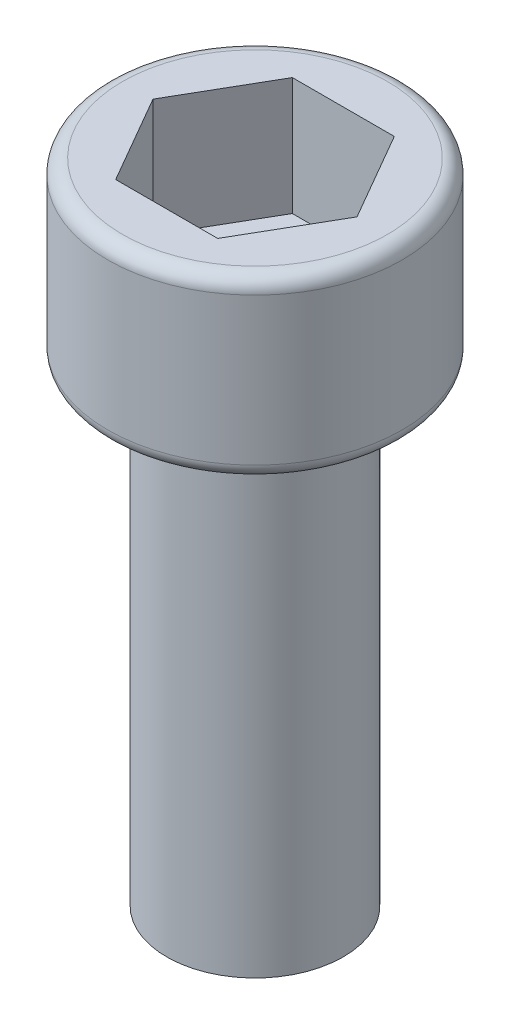
ISO-10303-21;
HEADER;
FILE_DESCRIPTION(('STEP AP214'),'2;1');
FILE_NAME('part.step','',(''),(''),'','','');
FILE_SCHEMA(('AUTOMOTIVE_DESIGN { 1 0 10303 214 1 1 1 1 }'));
ENDSEC;
DATA;
#1=APPLICATION_CONTEXT('core data for automotive mechanical design processes');
#2=APPLICATION_PROTOCOL_DEFINITION('international standard','automotive_design',2000,#1);
#3=PRODUCT_CONTEXT('',#1,'mechanical');
#4=PRODUCT('Part','Part','',(#3));
#5=PRODUCT_RELATED_PRODUCT_CATEGORY('part','',(#4));
#6=PRODUCT_DEFINITION_FORMATION('','',#4);
#7=PRODUCT_DEFINITION_CONTEXT('part definition',#1,'design');
#8=PRODUCT_DEFINITION('design','',#6,#7);
#9=PRODUCT_DEFINITION_SHAPE('','',#8);
#10=(LENGTH_UNIT() NAMED_UNIT(*) SI_UNIT(.MILLI.,.METRE.));
#11=(NAMED_UNIT(*) PLANE_ANGLE_UNIT() SI_UNIT($,.RADIAN.));
#12=(NAMED_UNIT(*) SI_UNIT($,.STERADIAN.) SOLID_ANGLE_UNIT());
#13=UNCERTAINTY_MEASURE_WITH_UNIT(LENGTH_MEASURE(1.E-05),#10,'distance_accuracy_value','');
#14=(GEOMETRIC_REPRESENTATION_CONTEXT(3) GLOBAL_UNCERTAINTY_ASSIGNED_CONTEXT((#13)) GLOBAL_UNIT_ASSIGNED_CONTEXT((#10,
#11,#12)) REPRESENTATION_CONTEXT('',''));
#15=CARTESIAN_POINT('',(0.,0.,0.));
#16=DIRECTION('',(0.,0.,1.));
#17=DIRECTION('',(1.,0.,0.));
#18=AXIS2_PLACEMENT_3D('',#15,#16,#17);
#19=CARTESIAN_POINT('',(0.,-5.5,0.));
#20=DIRECTION('',(0.,-1.,0.));
#21=DIRECTION('',(1.,0.,0.));
#22=AXIS2_PLACEMENT_3D('',#19,#20,#21);
#23=PLANE('',#22);
#24=CARTESIAN_POINT('',(0.,-5.49999999999995,0.));
#25=DIRECTION('',(0.,-1.,0.));
#26=DIRECTION('',(1.,0.,0.));
#27=AXIS2_PLACEMENT_3D('',#24,#25,#26);
#28=CIRCLE('',#27,1.49999999999998);
#29=CARTESIAN_POINT('',(1.5,-5.49999999999994,0.));
#30=VERTEX_POINT('',#29);
#31=EDGE_CURVE('E171',#30,#30,#28,.T.);
#32=ORIENTED_EDGE('',*,*,#31,.T.);
#33=EDGE_LOOP('',(#32));
#34=FACE_BOUND('',#33,.T.);
#35=ADVANCED_FACE('F43',(#34),#23,.T.);
#36=CARTESIAN_POINT('',(3.42844774755202E-12,-1000.,0.));
#37=DIRECTION('',(0.,-1.,0.));
#38=DIRECTION('',(1.,0.,0.));
#39=AXIS2_PLACEMENT_3D('',#36,#37,#38);
#40=CYLINDRICAL_SURFACE('',#39,1.5);
#41=CARTESIAN_POINT('',(0.,2.49999999999995,0.));
#42=DIRECTION('',(0.,-1.,0.));
#43=DIRECTION('',(1.,0.,0.));
#44=AXIS2_PLACEMENT_3D('',#41,#42,#43);
#45=CIRCLE('',#44,1.50000000000001);
#46=CARTESIAN_POINT('',(1.5,2.49999999999995,0.));
#47=VERTEX_POINT('',#46);
#48=EDGE_CURVE('E158',#47,#47,#45,.T.);
#49=ORIENTED_EDGE('',*,*,#48,.T.);
#50=EDGE_LOOP('',(#49));
#51=FACE_BOUND('',#50,.T.);
#52=ORIENTED_EDGE('',*,*,#31,.F.);
#53=EDGE_LOOP('',(#52));
#54=FACE_BOUND('',#53,.T.);
#55=ADVANCED_FACE('F197',(#51,#54),#40,.T.);
#56=CARTESIAN_POINT('',(1.5,2.5,0.));
#57=DIRECTION('',(0.,-1.,0.));
#58=DIRECTION('',(1.,0.,0.));
#59=AXIS2_PLACEMENT_3D('',#56,#57,#58);
#60=PLANE('',#59);
#61=CARTESIAN_POINT('',(0.,2.49999999999999,0.));
#62=DIRECTION('',(0.,-1.,0.));
#63=DIRECTION('',(1.,0.,0.));
#64=AXIS2_PLACEMENT_3D('',#61,#62,#63);
#65=CIRCLE('',#64,2.25000000000002);
#66=CARTESIAN_POINT('',(2.25000000000001,2.5,0.));
#67=VERTEX_POINT('',#66);
#68=EDGE_CURVE('E175',#67,#67,#65,.T.);
#69=ORIENTED_EDGE('',*,*,#68,.T.);
#70=EDGE_LOOP('',(#69));
#71=FACE_BOUND('',#70,.T.);
#72=ORIENTED_EDGE('',*,*,#48,.F.);
#73=EDGE_LOOP('',(#72));
#74=FACE_BOUND('',#73,.T.);
#75=ADVANCED_FACE('F194',(#71,#74),#60,.T.);
#76=CARTESIAN_POINT('',(3.42844774755202E-12,-1000.,0.));
#77=DIRECTION('',(0.,-1.,0.));
#78=DIRECTION('',(1.,0.,0.));
#79=AXIS2_PLACEMENT_3D('',#76,#77,#78);
#80=CYLINDRICAL_SURFACE('',#79,2.50000000000002);
#81=CARTESIAN_POINT('',(0.,2.75000000000003,0.));
#82=DIRECTION('',(0.,-1.,0.));
#83=DIRECTION('',(1.,0.,0.));
#84=AXIS2_PLACEMENT_3D('',#81,#82,#83);
#85=CIRCLE('',#84,2.50000000000002);
#86=CARTESIAN_POINT('',(2.5,2.75000000000004,0.));
#87=VERTEX_POINT('',#86);
#88=EDGE_CURVE('E52',#87,#87,#85,.F.);
#89=ORIENTED_EDGE('',*,*,#88,.T.);
#90=EDGE_LOOP('',(#89));
#91=FACE_BOUND('',#90,.T.);
#92=CARTESIAN_POINT('',(0.,5.24999999999998,0.));
#93=DIRECTION('',(0.,1.,0.));
#94=DIRECTION('',(-1.,0.,0.));
#95=AXIS2_PLACEMENT_3D('',#92,#93,#94);
#96=CIRCLE('',#95,2.50000000000002);
#97=CARTESIAN_POINT('',(-2.50000000000004,5.24999999999997,0.));
#98=VERTEX_POINT('',#97);
#99=EDGE_CURVE('E179',#98,#98,#96,.F.);
#100=ORIENTED_EDGE('',*,*,#99,.T.);
#101=EDGE_LOOP('',(#100));
#102=FACE_BOUND('',#101,.T.);
#103=ADVANCED_FACE('F186',(#91,#102),#80,.T.);
#104=CARTESIAN_POINT('',(2.5,5.50000000000001,0.));
#105=DIRECTION('',(0.,1.,0.));
#106=DIRECTION('',(-1.,0.,0.));
#107=AXIS2_PLACEMENT_3D('',#104,#105,#106);
#108=PLANE('',#107);
#109=CARTESIAN_POINT('',(0.,5.5,0.));
#110=DIRECTION('',(0.,1.,0.));
#111=DIRECTION('',(-1.,0.,0.));
#112=AXIS2_PLACEMENT_3D('',#109,#110,#111);
#113=CIRCLE('',#112,2.25000000000002);
#114=CARTESIAN_POINT('',(-2.25000000000004,5.49999999999999,0.));
#115=VERTEX_POINT('',#114);
#116=EDGE_CURVE('E11',#115,#115,#113,.T.);
#117=ORIENTED_EDGE('',*,*,#116,.T.);
#118=EDGE_LOOP('',(#117));
#119=FACE_BOUND('',#118,.T.);
#120=DIRECTION('',(-0.5,0.,-0.866025403784438));
#121=VECTOR('',#120,1.);
#122=CARTESIAN_POINT('',(1.73205080756886,5.5,0.));
#123=LINE('',#122,#121);
#124=CARTESIAN_POINT('',(1.73205080756886,5.5,0.));
#125=VERTEX_POINT('',#124);
#126=CARTESIAN_POINT('',(0.866025403784427,5.5,-1.5));
#127=VERTEX_POINT('',#126);
#128=EDGE_CURVE('E59',#125,#127,#123,.T.);
#129=ORIENTED_EDGE('',*,*,#128,.F.);
#130=DIRECTION('',(0.5,0.,-0.866025403784439));
#131=VECTOR('',#130,1.);
#132=CARTESIAN_POINT('',(0.866025403784421,5.5,1.5));
#133=LINE('',#132,#131);
#134=CARTESIAN_POINT('',(0.866025403784421,5.5,1.5));
#135=VERTEX_POINT('',#134);
#136=EDGE_CURVE('E152',#135,#125,#133,.T.);
#137=ORIENTED_EDGE('',*,*,#136,.F.);
#138=DIRECTION('',(1.,0.,0.));
#139=VECTOR('',#138,1.);
#140=CARTESIAN_POINT('',(-0.866025403784456,5.49999999999999,1.5));
#141=LINE('',#140,#139);
#142=CARTESIAN_POINT('',(-0.866025403784456,5.49999999999999,1.5));
#143=VERTEX_POINT('',#142);
#144=EDGE_CURVE('E149',#143,#135,#141,.T.);
#145=ORIENTED_EDGE('',*,*,#144,.F.);
#146=DIRECTION('',(0.5,0.,0.866025403784438));
#147=VECTOR('',#146,1.);
#148=CARTESIAN_POINT('',(-1.7320508075689,5.49999999999999,0.));
#149=LINE('',#148,#147);
#150=CARTESIAN_POINT('',(-1.7320508075689,5.49999999999999,0.));
#151=VERTEX_POINT('',#150);
#152=EDGE_CURVE('E107',#151,#143,#149,.T.);
#153=ORIENTED_EDGE('',*,*,#152,.F.);
#154=DIRECTION('',(-0.5,0.,0.866025403784439));
#155=VECTOR('',#154,1.);
#156=CARTESIAN_POINT('',(-0.866025403784458,5.49999999999999,-1.5));
#157=LINE('',#156,#155);
#158=CARTESIAN_POINT('',(-0.866025403784458,5.49999999999999,-1.5));
#159=VERTEX_POINT('',#158);
#160=EDGE_CURVE('E143',#159,#151,#157,.T.);
#161=ORIENTED_EDGE('',*,*,#160,.F.);
#162=DIRECTION('',(-1.,0.,0.));
#163=VECTOR('',#162,1.);
#164=CARTESIAN_POINT('',(0.86602540378442,5.5,-1.5));
#165=LINE('',#164,#163);
#166=EDGE_CURVE('E139',#127,#159,#165,.T.);
#167=ORIENTED_EDGE('',*,*,#166,.F.);
#168=EDGE_LOOP('',(#129,#137,#145,#153,#161,#167));
#169=FACE_BOUND('',#168,.T.);
#170=ADVANCED_FACE('F213',(#119,#169),#108,.T.);
#171=CARTESIAN_POINT('',(1.73205080756887,3.5,0.));
#172=DIRECTION('',(0.866025403784439,0.,-0.5));
#173=DIRECTION('',(-0.5,0.,-0.866025403784438));
#174=AXIS2_PLACEMENT_3D('',#171,#172,#173);
#175=PLANE('',#174);
#176=ORIENTED_EDGE('',*,*,#128,.T.);
#177=DIRECTION('',(0.,1.,0.));
#178=VECTOR('',#177,1.);
#179=CARTESIAN_POINT('',(0.866025403784427,3.5,-1.5));
#180=LINE('',#179,#178);
#181=CARTESIAN_POINT('',(0.866025403784427,3.5,-1.5));
#182=VERTEX_POINT('',#181);
#183=EDGE_CURVE('E89',#182,#127,#180,.T.);
#184=ORIENTED_EDGE('',*,*,#183,.F.);
#185=DIRECTION('',(-0.5,0.,-0.866025403784438));
#186=VECTOR('',#185,1.);
#187=CARTESIAN_POINT('',(1.73205080756887,3.5,0.));
#188=LINE('',#187,#186);
#189=CARTESIAN_POINT('',(1.73205080756887,3.5,0.));
#190=VERTEX_POINT('',#189);
#191=EDGE_CURVE('E155',#190,#182,#188,.T.);
#192=ORIENTED_EDGE('',*,*,#191,.F.);
#193=DIRECTION('',(0.,1.,0.));
#194=VECTOR('',#193,1.);
#195=CARTESIAN_POINT('',(1.73205080756887,3.5,0.));
#196=LINE('',#195,#194);
#197=EDGE_CURVE('E67',#190,#125,#196,.T.);
#198=ORIENTED_EDGE('',*,*,#197,.T.);
#199=EDGE_LOOP('',(#176,#184,#192,#198));
#200=FACE_BOUND('',#199,.T.);
#201=ADVANCED_FACE('F216',(#200),#175,.F.);
#202=CARTESIAN_POINT('',(0.866025403784427,3.5,1.5));
#203=DIRECTION('',(0.866025403784439,0.,0.499999999999999));
#204=DIRECTION('',(0.5,0.,-0.866025403784439));
#205=AXIS2_PLACEMENT_3D('',#202,#203,#204);
#206=PLANE('',#205);
#207=ORIENTED_EDGE('',*,*,#136,.T.);
#208=ORIENTED_EDGE('',*,*,#197,.F.);
#209=DIRECTION('',(0.5,0.,-0.866025403784439));
#210=VECTOR('',#209,1.);
#211=CARTESIAN_POINT('',(0.866025403784427,3.5,1.5));
#212=LINE('',#211,#210);
#213=CARTESIAN_POINT('',(0.866025403784427,3.5,1.5));
#214=VERTEX_POINT('',#213);
#215=EDGE_CURVE('E121',#214,#190,#212,.T.);
#216=ORIENTED_EDGE('',*,*,#215,.F.);
#217=DIRECTION('',(0.,1.,0.));
#218=VECTOR('',#217,1.);
#219=CARTESIAN_POINT('',(0.866025403784427,3.5,1.5));
#220=LINE('',#219,#218);
#221=EDGE_CURVE('E112',#214,#135,#220,.T.);
#222=ORIENTED_EDGE('',*,*,#221,.T.);
#223=EDGE_LOOP('',(#207,#208,#216,#222));
#224=FACE_BOUND('',#223,.T.);
#225=ADVANCED_FACE('F220',(#224),#206,.F.);
#226=CARTESIAN_POINT('',(-0.86602540378445,3.49999999999999,1.5));
#227=DIRECTION('',(0.,0.,1.));
#228=DIRECTION('',(1.,0.,0.));
#229=AXIS2_PLACEMENT_3D('',#226,#227,#228);
#230=PLANE('',#229);
#231=ORIENTED_EDGE('',*,*,#144,.T.);
#232=ORIENTED_EDGE('',*,*,#221,.F.);
#233=DIRECTION('',(1.,0.,0.));
#234=VECTOR('',#233,1.);
#235=CARTESIAN_POINT('',(-0.86602540378445,3.49999999999999,1.5));
#236=LINE('',#235,#234);
#237=CARTESIAN_POINT('',(-0.86602540378445,3.49999999999999,1.5));
#238=VERTEX_POINT('',#237);
#239=EDGE_CURVE('E116',#238,#214,#236,.T.);
#240=ORIENTED_EDGE('',*,*,#239,.F.);
#241=DIRECTION('',(0.,1.,0.));
#242=VECTOR('',#241,1.);
#243=CARTESIAN_POINT('',(-0.86602540378445,3.49999999999999,1.5));
#244=LINE('',#243,#242);
#245=EDGE_CURVE('E100',#238,#143,#244,.T.);
#246=ORIENTED_EDGE('',*,*,#245,.T.);
#247=EDGE_LOOP('',(#231,#232,#240,#246));
#248=FACE_BOUND('',#247,.T.);
#249=ADVANCED_FACE('F117',(#248),#230,.F.);
#250=CARTESIAN_POINT('',(-1.73205080756889,3.49999999999999,0.));
#251=DIRECTION('',(-0.866025403784438,0.,0.5));
#252=DIRECTION('',(0.5,0.,0.866025403784438));
#253=AXIS2_PLACEMENT_3D('',#250,#251,#252);
#254=PLANE('',#253);
#255=ORIENTED_EDGE('',*,*,#152,.T.);
#256=ORIENTED_EDGE('',*,*,#245,.F.);
#257=DIRECTION('',(0.5,0.,0.866025403784438));
#258=VECTOR('',#257,1.);
#259=CARTESIAN_POINT('',(-1.73205080756889,3.49999999999999,0.));
#260=LINE('',#259,#258);
#261=CARTESIAN_POINT('',(-1.73205080756889,3.49999999999999,0.));
#262=VERTEX_POINT('',#261);
#263=EDGE_CURVE('E104',#262,#238,#260,.T.);
#264=ORIENTED_EDGE('',*,*,#263,.F.);
#265=DIRECTION('',(0.,1.,0.));
#266=VECTOR('',#265,1.);
#267=CARTESIAN_POINT('',(-1.73205080756889,3.49999999999999,0.));
#268=LINE('',#267,#266);
#269=EDGE_CURVE('E113',#262,#151,#268,.T.);
#270=ORIENTED_EDGE('',*,*,#269,.T.);
#271=EDGE_LOOP('',(#255,#256,#264,#270));
#272=FACE_BOUND('',#271,.T.);
#273=ADVANCED_FACE('F102',(#272),#254,.F.);
#274=CARTESIAN_POINT('',(-0.866025403784451,3.49999999999999,-1.5));
#275=DIRECTION('',(-0.866025403784439,0.,-0.499999999999999));
#276=DIRECTION('',(-0.5,0.,0.866025403784439));
#277=AXIS2_PLACEMENT_3D('',#274,#275,#276);
#278=PLANE('',#277);
#279=ORIENTED_EDGE('',*,*,#160,.T.);
#280=ORIENTED_EDGE('',*,*,#269,.F.);
#281=DIRECTION('',(-0.5,0.,0.866025403784439));
#282=VECTOR('',#281,1.);
#283=CARTESIAN_POINT('',(-0.866025403784451,3.49999999999999,-1.5));
#284=LINE('',#283,#282);
#285=CARTESIAN_POINT('',(-0.866025403784451,3.49999999999999,-1.5));
#286=VERTEX_POINT('',#285);
#287=EDGE_CURVE('E127',#286,#262,#284,.T.);
#288=ORIENTED_EDGE('',*,*,#287,.F.);
#289=DIRECTION('',(0.,1.,0.));
#290=VECTOR('',#289,1.);
#291=CARTESIAN_POINT('',(-0.866025403784451,3.49999999999999,-1.5));
#292=LINE('',#291,#290);
#293=EDGE_CURVE('E163',#286,#159,#292,.T.);
#294=ORIENTED_EDGE('',*,*,#293,.T.);
#295=EDGE_LOOP('',(#279,#280,#288,#294));
#296=FACE_BOUND('',#295,.T.);
#297=ADVANCED_FACE('F224',(#296),#278,.F.);
#298=CARTESIAN_POINT('',(0.866025403784427,3.5,-1.5));
#299=DIRECTION('',(0.,0.,-1.));
#300=DIRECTION('',(-1.,0.,0.));
#301=AXIS2_PLACEMENT_3D('',#298,#299,#300);
#302=PLANE('',#301);
#303=ORIENTED_EDGE('',*,*,#166,.T.);
#304=ORIENTED_EDGE('',*,*,#293,.F.);
#305=DIRECTION('',(-1.,0.,0.));
#306=VECTOR('',#305,1.);
#307=CARTESIAN_POINT('',(0.866025403784427,3.5,-1.5));
#308=LINE('',#307,#306);
#309=EDGE_CURVE('E131',#182,#286,#308,.T.);
#310=ORIENTED_EDGE('',*,*,#309,.F.);
#311=ORIENTED_EDGE('',*,*,#183,.T.);
#312=EDGE_LOOP('',(#303,#304,#310,#311));
#313=FACE_BOUND('',#312,.T.);
#314=ADVANCED_FACE('F221',(#313),#302,.F.);
#315=CARTESIAN_POINT('',(0.,3.5,0.));
#316=DIRECTION('',(0.,1.,0.));
#317=DIRECTION('',(-1.,0.,0.));
#318=AXIS2_PLACEMENT_3D('',#315,#316,#317);
#319=PLANE('',#318);
#320=ORIENTED_EDGE('',*,*,#191,.T.);
#321=ORIENTED_EDGE('',*,*,#309,.T.);
#322=ORIENTED_EDGE('',*,*,#287,.T.);
#323=ORIENTED_EDGE('',*,*,#263,.T.);
#324=ORIENTED_EDGE('',*,*,#239,.T.);
#325=ORIENTED_EDGE('',*,*,#215,.T.);
#326=EDGE_LOOP('',(#320,#321,#322,#323,#324,#325));
#327=FACE_BOUND('',#326,.T.);
#328=ADVANCED_FACE('F124',(#327),#319,.T.);
#329=CARTESIAN_POINT('',(0.,2.75000000000003,0.));
#330=DIRECTION('',(0.,-1.,0.));
#331=DIRECTION('',(1.,0.,0.));
#332=AXIS2_PLACEMENT_3D('',#329,#330,#331);
#333=TOROIDAL_SURFACE('',#332,2.25000000000002,0.25);
#334=ORIENTED_EDGE('',*,*,#88,.F.);
#335=EDGE_LOOP('',(#334));
#336=FACE_BOUND('',#335,.T.);
#337=ORIENTED_EDGE('',*,*,#68,.F.);
#338=EDGE_LOOP('',(#337));
#339=FACE_BOUND('',#338,.T.);
#340=ADVANCED_FACE('F189',(#336,#339),#333,.T.);
#341=CARTESIAN_POINT('',(0.,5.24999999999998,0.));
#342=DIRECTION('',(0.,1.,0.));
#343=DIRECTION('',(-1.,0.,0.));
#344=AXIS2_PLACEMENT_3D('',#341,#342,#343);
#345=TOROIDAL_SURFACE('',#344,2.25000000000002,0.25);
#346=ORIENTED_EDGE('',*,*,#116,.F.);
#347=EDGE_LOOP('',(#346));
#348=FACE_BOUND('',#347,.T.);
#349=ORIENTED_EDGE('',*,*,#99,.F.);
#350=EDGE_LOOP('',(#349));
#351=FACE_BOUND('',#350,.T.);
#352=ADVANCED_FACE('F45',(#348,#351),#345,.T.);
#353=CLOSED_SHELL('',(#35,#55,#75,#103,#170,#201,#225,#249,#273,#297,#314,#328,#340,#352));
#354=MANIFOLD_SOLID_BREP('B2',#353);
#355=ADVANCED_BREP_SHAPE_REPRESENTATION('',(#18,#354),#14);
#356=SHAPE_DEFINITION_REPRESENTATION(#9,#355);
ENDSEC;
END-ISO-10303-21;
